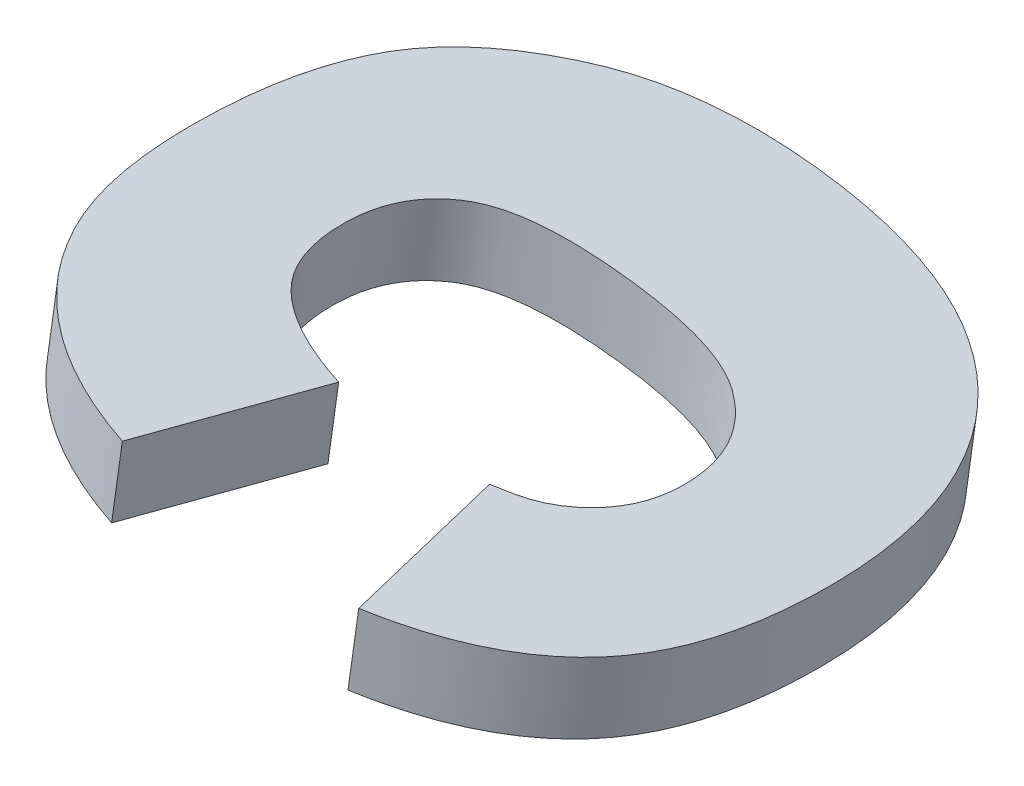
ISO-10303-21;
HEADER;
FILE_DESCRIPTION(('STEP AP214'),'2;1');
FILE_NAME('part.step','',(''),(''),'','','');
FILE_SCHEMA(('AUTOMOTIVE_DESIGN { 1 0 10303 214 1 1 1 1 }'));
ENDSEC;
DATA;
#1=APPLICATION_CONTEXT('core data for automotive mechanical design processes');
#2=APPLICATION_PROTOCOL_DEFINITION('international standard','automotive_design',2000,#1);
#3=PRODUCT_CONTEXT('',#1,'mechanical');
#4=PRODUCT('Part','Part','',(#3));
#5=PRODUCT_RELATED_PRODUCT_CATEGORY('part','',(#4));
#6=PRODUCT_DEFINITION_FORMATION('','',#4);
#7=PRODUCT_DEFINITION_CONTEXT('part definition',#1,'design');
#8=PRODUCT_DEFINITION('design','',#6,#7);
#9=PRODUCT_DEFINITION_SHAPE('','',#8);
#10=(LENGTH_UNIT() NAMED_UNIT(*) SI_UNIT(.MILLI.,.METRE.));
#11=(NAMED_UNIT(*) PLANE_ANGLE_UNIT() SI_UNIT($,.RADIAN.));
#12=(NAMED_UNIT(*) SI_UNIT($,.STERADIAN.) SOLID_ANGLE_UNIT());
#13=UNCERTAINTY_MEASURE_WITH_UNIT(LENGTH_MEASURE(1.E-05),#10,'distance_accuracy_value','');
#14=(GEOMETRIC_REPRESENTATION_CONTEXT(3) GLOBAL_UNCERTAINTY_ASSIGNED_CONTEXT((#13)) GLOBAL_UNIT_ASSIGNED_CONTEXT((#10,
#11,#12)) REPRESENTATION_CONTEXT('',''));
#15=CARTESIAN_POINT('',(0.,0.,0.));
#16=DIRECTION('',(0.,0.,1.));
#17=DIRECTION('',(1.,0.,0.));
#18=AXIS2_PLACEMENT_3D('',#15,#16,#17);
#19=CARTESIAN_POINT('',(836.899996555761,618.062883519436,1627.11185972195));
#20=DIRECTION('',(0.947941965636704,-0.133001987377289,0.289338039563609));
#21=DIRECTION('',(0.286420824998837,-0.0409901500375597,-0.957226680889582));
#22=AXIS2_PLACEMENT_3D('',#19,#20,#21);
#23=PLANE('',#22);
#24=CARTESIAN_POINT('',(835.50826594994,608.160205705058,1627.11947716642));
#25=CARTESIAN_POINT('',(832.267063206222,608.624059500493,1637.95167047664));
#26=CARTESIAN_POINT('',(829.025860462504,609.087913295927,1648.78386378686));
#27=B_SPLINE_CURVE_WITH_KNOTS('',2,(#24,#25,#26),.UNSPECIFIED.,.F.,.F.,(3,3),(0.,1.),.UNSPECIFIED.);
#28=CARTESIAN_POINT('',(835.50826594994,608.160205705058,1627.11947716642));
#29=VERTEX_POINT('',#28);
#30=CARTESIAN_POINT('',(829.025860462504,609.087913295927,1648.78386378686));
#31=VERTEX_POINT('',#30);
#32=EDGE_CURVE('E91',#29,#31,#27,.T.);
#33=ORIENTED_EDGE('',*,*,#32,.F.);
#34=DIRECTION('',(-0.139173060582166,-0.990267781437723,0.000761744447259926));
#35=VECTOR('',#34,1.);
#36=CARTESIAN_POINT('',(836.899996555761,618.062883519436,1627.11185972195));
#37=LINE('',#36,#35);
#38=CARTESIAN_POINT('',(836.899996555761,618.062883519436,1627.11185972195));
#39=VERTEX_POINT('',#38);
#40=EDGE_CURVE('E33',#39,#29,#37,.T.);
#41=ORIENTED_EDGE('',*,*,#40,.F.);
#42=CARTESIAN_POINT('',(836.899996555761,618.062883519436,1627.11185972195));
#43=CARTESIAN_POINT('',(833.658793812044,618.52673731487,1637.94405303217));
#44=CARTESIAN_POINT('',(830.417591068326,618.990591110304,1648.77624634238));
#45=B_SPLINE_CURVE_WITH_KNOTS('',2,(#42,#43,#44),.UNSPECIFIED.,.F.,.F.,(3,3),(0.,1.),.UNSPECIFIED.);
#46=CARTESIAN_POINT('',(830.417591068326,618.990591110304,1648.77624634238));
#47=VERTEX_POINT('',#46);
#48=EDGE_CURVE('E72',#39,#47,#45,.T.);
#49=ORIENTED_EDGE('',*,*,#48,.T.);
#50=DIRECTION('',(-0.139173060582166,-0.990267781437723,0.000761744447259926));
#51=VECTOR('',#50,1.);
#52=CARTESIAN_POINT('',(830.417591068326,618.990591110304,1648.77624634238));
#53=LINE('',#52,#51);
#54=EDGE_CURVE('E11',#47,#31,#53,.T.);
#55=ORIENTED_EDGE('',*,*,#54,.T.);
#56=EDGE_LOOP('',(#33,#41,#49,#55));
#57=FACE_BOUND('',#56,.T.);
#58=ADVANCED_FACE('F17',(#57),#23,.T.);
#59=CARTESIAN_POINT('',(830.417591068326,618.990591110304,1648.77624634238));
#60=CARTESIAN_POINT('',(821.392815731174,620.257261484778,1646.59343660733));
#61=CARTESIAN_POINT('',(815.339929459303,621.1043291423,1641.90039567695));
#62=CARTESIAN_POINT('',(809.287043187433,621.951396799823,1637.20735474658));
#63=CARTESIAN_POINT('',(806.206072014379,622.379046978616,1630.24964871609));
#64=CARTESIAN_POINT('',(803.125100841324,622.806697157409,1623.2919426856));
#65=CARTESIAN_POINT('',(803.123961151045,622.798587839705,1612.54160474045));
#66=CARTESIAN_POINT('',(803.122578481113,622.788749631932,1599.49931657349));
#67=CARTESIAN_POINT('',(806.874892303202,622.255036783102,1591.23192470196));
#68=CARTESIAN_POINT('',(810.627206125291,621.721323934271,1582.96453283044));
#69=CARTESIAN_POINT('',(820.077094442531,620.38861126019,1576.96180605903));
#70=CARTESIAN_POINT('',(829.52698275977,619.055898586108,1570.95907928763));
#71=CARTESIAN_POINT('',(844.270392333693,616.98384749823,1570.95907928763));
#72=CARTESIAN_POINT('',(863.927145949231,614.221270937562,1570.95907928763));
#73=CARTESIAN_POINT('',(874.48617119914,612.745419286138,1581.51842138097));
#74=CARTESIAN_POINT('',(885.045196449048,611.269567634713,1592.0777634743));
#75=CARTESIAN_POINT('',(885.047244420412,611.28413970815,1611.39562962955));
#76=CARTESIAN_POINT('',(885.048846929078,611.295542149795,1626.51158704481));
#77=CARTESIAN_POINT('',(878.997375145904,612.152674417361,1635.16097061997));
#78=CARTESIAN_POINT('',(872.94590336273,613.009806684927,1643.81035419513));
#79=CARTESIAN_POINT('',(860.409257859641,614.774949545792,1648.01226293512));
#80=B_SPLINE_CURVE_WITH_KNOTS('',2,(#59,#60,#61,#62,#63,#64,#65,#66,#67,#68,#69,#70,#71,#72,#73,
#74,#75,#76,#77,#78,#79),.UNSPECIFIED.,.F.,.F.,(3,2,2,2,2,2,2,2,2,2,3),(1.,2.,3.,4.,5.,6.,7.,8.,
9.,10.,11.),.UNSPECIFIED.);
#81=DIRECTION('',(-0.139173060582166,-0.990267781437723,0.000761744447259926));
#82=VECTOR('',#81,1.);
#83=SURFACE_OF_LINEAR_EXTRUSION('',#80,#82);
#84=CARTESIAN_POINT('',(829.025860462504,609.087913295927,1648.78386378686));
#85=CARTESIAN_POINT('',(820.001085125352,610.3545836704,1646.6010540518));
#86=CARTESIAN_POINT('',(813.948198853481,611.201651327923,1641.90801312143));
#87=CARTESIAN_POINT('',(807.895312581611,612.048718985445,1637.21497219106));
#88=CARTESIAN_POINT('',(804.814341408557,612.476369164239,1630.25726616056));
#89=CARTESIAN_POINT('',(801.733370235503,612.904019343032,1623.29956013007));
#90=CARTESIAN_POINT('',(801.732230545224,612.895910025328,1612.54922218492));
#91=CARTESIAN_POINT('',(801.730847875291,612.886071817555,1599.50693401796));
#92=CARTESIAN_POINT('',(805.48316169738,612.352358968725,1591.23954214644));
#93=CARTESIAN_POINT('',(809.235475519469,611.818646119894,1582.97215027491));
#94=CARTESIAN_POINT('',(818.685363836709,610.485933445813,1576.9694235035));
#95=CARTESIAN_POINT('',(828.135252153948,609.153220771731,1570.9666967321));
#96=CARTESIAN_POINT('',(842.878661727871,607.081169683853,1570.9666967321));
#97=CARTESIAN_POINT('',(862.53541534341,604.318593123185,1570.9666967321));
#98=CARTESIAN_POINT('',(873.094440593318,602.84274147176,1581.52603882544));
#99=CARTESIAN_POINT('',(883.653465843226,601.366889820335,1592.08538091877));
#100=CARTESIAN_POINT('',(883.65551381459,601.381461893773,1611.40324707402));
#101=CARTESIAN_POINT('',(883.657116323256,601.392864335418,1626.51920448929));
#102=CARTESIAN_POINT('',(877.605644540083,602.249996602984,1635.16858806444));
#103=CARTESIAN_POINT('',(871.554172756909,603.10712887055,1643.81797163961));
#104=CARTESIAN_POINT('',(859.01752725382,604.872271731415,1648.01988037959));
#105=B_SPLINE_CURVE_WITH_KNOTS('',2,(#84,#85,#86,#87,#88,#89,#90,#91,#92,#93,#94,#95,#96,#97,
#98,#99,#100,#101,#102,#103,#104),.UNSPECIFIED.,.F.,.F.,(3,2,2,2,2,2,2,2,2,2,3),(1.,2.,3.,4.,5.,
6.,7.,8.,9.,10.,11.),.UNSPECIFIED.);
#106=CARTESIAN_POINT('',(859.01752725382,604.872271731415,1648.01988037959));
#107=VERTEX_POINT('',#106);
#108=EDGE_CURVE('E115',#31,#107,#105,.T.);
#109=ORIENTED_EDGE('',*,*,#108,.F.);
#110=ORIENTED_EDGE('',*,*,#54,.F.);
#111=CARTESIAN_POINT('',(860.409257859641,614.774949545792,1648.01226293512));
#112=VERTEX_POINT('',#111);
#113=EDGE_CURVE('E68',#47,#112,#80,.T.);
#114=ORIENTED_EDGE('',*,*,#113,.T.);
#115=DIRECTION('',(-0.139173060582166,-0.990267781437723,0.000761744447259926));
#116=VECTOR('',#115,1.);
#117=CARTESIAN_POINT('',(860.409257859641,614.774949545792,1648.01226293512));
#118=LINE('',#117,#116);
#119=EDGE_CURVE('E25',#112,#107,#118,.T.);
#120=ORIENTED_EDGE('',*,*,#119,.T.);
#121=EDGE_LOOP('',(#109,#110,#114,#120));
#122=FACE_BOUND('',#121,.T.);
#123=ADVANCED_FACE('F69',(#122),#83,.T.);
#124=CARTESIAN_POINT('',(860.409257859641,614.774949545792,1648.01226293512));
#125=DIRECTION('',(-0.966606955237711,0.13601481660631,0.217188774455848));
#126=DIRECTION('',(0.215178654364865,-0.0294905189842749,0.976129323397143));
#127=AXIS2_PLACEMENT_3D('',#124,#125,#126);
#128=PLANE('',#127);
#129=CARTESIAN_POINT('',(859.01752725382,604.872271731415,1648.01988037959));
#130=CARTESIAN_POINT('',(856.611626466569,605.202003614208,1637.10583170431));
#131=CARTESIAN_POINT('',(854.205725679318,605.531735497002,1626.19178302902));
#132=B_SPLINE_CURVE_WITH_KNOTS('',2,(#129,#130,#131),.UNSPECIFIED.,.F.,.F.,(3,3),(11.,12.),.UNSPECIFIED.);
#133=CARTESIAN_POINT('',(854.205725679318,605.531735497002,1626.19178302902));
#134=VERTEX_POINT('',#133);
#135=EDGE_CURVE('E66',#107,#134,#132,.T.);
#136=ORIENTED_EDGE('',*,*,#135,.F.);
#137=ORIENTED_EDGE('',*,*,#119,.F.);
#138=CARTESIAN_POINT('',(860.409257859641,614.774949545792,1648.01226293512));
#139=CARTESIAN_POINT('',(858.003357072391,615.104681428585,1637.09821425984));
#140=CARTESIAN_POINT('',(855.59745628514,615.434413311379,1626.18416558455));
#141=B_SPLINE_CURVE_WITH_KNOTS('',2,(#138,#139,#140),.UNSPECIFIED.,.F.,.F.,(3,3),(11.,12.),.UNSPECIFIED.);
#142=CARTESIAN_POINT('',(855.59745628514,615.434413311379,1626.18416558455));
#143=VERTEX_POINT('',#142);
#144=EDGE_CURVE('E63',#112,#143,#141,.T.);
#145=ORIENTED_EDGE('',*,*,#144,.T.);
#146=DIRECTION('',(-0.139173060582166,-0.990267781437723,0.000761744447259926));
#147=VECTOR('',#146,1.);
#148=CARTESIAN_POINT('',(855.59745628514,615.434413311379,1626.18416558455));
#149=LINE('',#148,#147);
#150=EDGE_CURVE('E49',#143,#134,#149,.T.);
#151=ORIENTED_EDGE('',*,*,#150,.T.);
#152=EDGE_LOOP('',(#136,#137,#145,#151));
#153=FACE_BOUND('',#152,.T.);
#154=ADVANCED_FACE('F61',(#153),#128,.T.);
#155=CARTESIAN_POINT('',(855.59745628514,615.434413311379,1626.18416558455));
#156=CARTESIAN_POINT('',(859.217960203536,614.924703149328,1625.03819047365));
#157=CARTESIAN_POINT('',(860.89863506707,614.687540138427,1623.7907589423));
#158=CARTESIAN_POINT('',(863.702859675896,614.291831030199,1621.70940562769));
#159=CARTESIAN_POINT('',(865.215638673781,614.076915066049,1618.70804224199));
#160=CARTESIAN_POINT('',(866.728417671665,613.861999101901,1615.70667885628));
#161=CARTESIAN_POINT('',(866.728024276036,613.859199946551,1611.99590230668));
#162=CARTESIAN_POINT('',(866.72713335064,613.852860682965,1603.59208482672));
#163=CARTESIAN_POINT('',(860.050079610644,614.787797849572,1599.09208365164));
#164=CARTESIAN_POINT('',(855.067346071213,615.485492215787,1595.73396978052));
#165=CARTESIAN_POINT('',(844.435136383633,616.97975184001,1595.73396978052));
#166=CARTESIAN_POINT('',(831.264773716315,618.830725602609,1595.73396978052));
#167=CARTESIAN_POINT('',(826.380566098843,619.52026252419,1599.77216779037));
#168=CARTESIAN_POINT('',(821.496358481372,620.20979944577,1603.81036580022));
#169=CARTESIAN_POINT('',(821.497133702171,620.215315428371,1611.12277841266));
#170=CARTESIAN_POINT('',(821.49788578205,620.220666754775,1618.21691005159));
#171=CARTESIAN_POINT('',(825.443131019242,619.668990173869,1621.84583123613));
#172=CARTESIAN_POINT('',(829.388376256433,619.117313592962,1625.47475242066));
#173=CARTESIAN_POINT('',(836.899996555761,618.062883519436,1627.11185972195));
#174=B_SPLINE_CURVE_WITH_KNOTS('',2,(#155,#156,#157,#158,#159,#160,#161,#162,#163,#164,#165,
#166,#167,#168,#169,#170,#171,#172,#173),.UNSPECIFIED.,.F.,.F.,(3,2,2,2,2,2,2,2,2,3),(12.,13.,
14.,15.,16.,17.,18.,19.,20.,21.),.UNSPECIFIED.);
#175=DIRECTION('',(-0.139173060582166,-0.990267781437723,0.000761744447259926));
#176=VECTOR('',#175,1.);
#177=SURFACE_OF_LINEAR_EXTRUSION('',#174,#176);
#178=CARTESIAN_POINT('',(854.205725679318,605.531735497002,1626.19178302902));
#179=CARTESIAN_POINT('',(857.826229597714,605.022025334951,1625.04580791812));
#180=CARTESIAN_POINT('',(859.506904461249,604.78486232405,1623.79837638678));
#181=CARTESIAN_POINT('',(862.311129070074,604.389153215821,1621.71702307216));
#182=CARTESIAN_POINT('',(863.823908067959,604.174237251672,1618.71565968645));
#183=CARTESIAN_POINT('',(865.336687065844,603.959321287524,1615.71429630075));
#184=CARTESIAN_POINT('',(865.336293670214,603.956522132174,1612.00351975116));
#185=CARTESIAN_POINT('',(865.335402744819,603.950182868588,1603.59970227119));
#186=CARTESIAN_POINT('',(858.658349004822,604.885120035195,1599.09970109612));
#187=CARTESIAN_POINT('',(853.675615465392,605.58281440141,1595.74158722499));
#188=CARTESIAN_POINT('',(843.043405777812,607.077074025633,1595.74158722499));
#189=CARTESIAN_POINT('',(829.873043110493,608.928047788232,1595.74158722499));
#190=CARTESIAN_POINT('',(824.988835493022,609.617584709812,1599.77978523484));
#191=CARTESIAN_POINT('',(820.10462787555,610.307121631393,1603.8179832447));
#192=CARTESIAN_POINT('',(820.105403096349,610.312637613994,1611.13039585713));
#193=CARTESIAN_POINT('',(820.106155176229,610.317988940398,1618.22452749607));
#194=CARTESIAN_POINT('',(824.05140041342,609.766312359491,1621.8534486806));
#195=CARTESIAN_POINT('',(827.996645650612,609.214635778585,1625.48236986513));
#196=CARTESIAN_POINT('',(835.50826594994,608.160205705058,1627.11947716642));
#197=B_SPLINE_CURVE_WITH_KNOTS('',2,(#178,#179,#180,#181,#182,#183,#184,#185,#186,#187,#188,
#189,#190,#191,#192,#193,#194,#195,#196),.UNSPECIFIED.,.F.,.F.,(3,2,2,2,2,2,2,2,2,3),(12.,13.,
14.,15.,16.,17.,18.,19.,20.,21.),.UNSPECIFIED.);
#198=EDGE_CURVE('E116',#134,#29,#197,.T.);
#199=ORIENTED_EDGE('',*,*,#198,.F.);
#200=ORIENTED_EDGE('',*,*,#150,.F.);
#201=EDGE_CURVE('E75',#143,#39,#174,.T.);
#202=ORIENTED_EDGE('',*,*,#201,.T.);
#203=ORIENTED_EDGE('',*,*,#40,.T.);
#204=EDGE_LOOP('',(#199,#200,#202,#203));
#205=FACE_BOUND('',#204,.T.);
#206=ADVANCED_FACE('F99',(#205),#177,.T.);
#207=CARTESIAN_POINT('',(820.077094442531,620.38861126019,1576.96180605903));
#208=DIRECTION('',(0.139173060582166,0.990267781437723,-0.000761744447259926));
#209=DIRECTION('',(-0.947941965636704,0.133001987377289,-0.289338039563609));
#210=AXIS2_PLACEMENT_3D('',#207,#208,#209);
#211=PLANE('',#210);
#212=ORIENTED_EDGE('',*,*,#48,.F.);
#213=ORIENTED_EDGE('',*,*,#201,.F.);
#214=ORIENTED_EDGE('',*,*,#144,.F.);
#215=ORIENTED_EDGE('',*,*,#113,.F.);
#216=EDGE_LOOP('',(#212,#213,#214,#215));
#217=FACE_BOUND('',#216,.T.);
#218=ADVANCED_FACE('F74',(#217),#211,.T.);
#219=CARTESIAN_POINT('',(818.685363836709,610.485933445813,1576.9694235035));
#220=DIRECTION('',(0.139173060582166,0.990267781437723,-0.000761744447259926));
#221=DIRECTION('',(-0.947941965636704,0.133001987377289,-0.289338039563609));
#222=AXIS2_PLACEMENT_3D('',#219,#220,#221);
#223=PLANE('',#222);
#224=ORIENTED_EDGE('',*,*,#32,.T.);
#225=ORIENTED_EDGE('',*,*,#108,.T.);
#226=ORIENTED_EDGE('',*,*,#135,.T.);
#227=ORIENTED_EDGE('',*,*,#198,.T.);
#228=EDGE_LOOP('',(#224,#225,#226,#227));
#229=FACE_BOUND('',#228,.T.);
#230=ADVANCED_FACE('F103',(#229),#223,.F.);
#231=CLOSED_SHELL('',(#58,#123,#154,#206,#218,#230));
#232=MANIFOLD_SOLID_BREP('B1',#231);
#233=ADVANCED_BREP_SHAPE_REPRESENTATION('',(#18,#232),#14);
#234=SHAPE_DEFINITION_REPRESENTATION(#9,#233);
ENDSEC;
END-ISO-10303-21;
